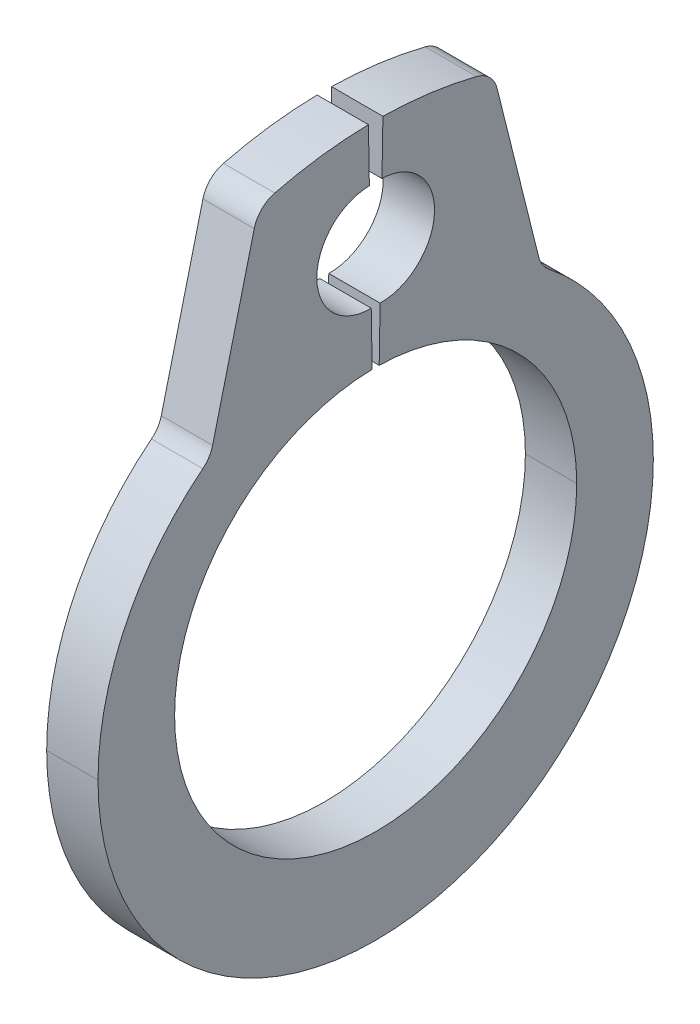
ISO-10303-21;
HEADER;
FILE_DESCRIPTION(('STEP AP214'),'2;1');
FILE_NAME('part.step','',(''),(''),'','','');
FILE_SCHEMA(('AUTOMOTIVE_DESIGN { 1 0 10303 214 1 1 1 1 }'));
ENDSEC;
DATA;
#1=APPLICATION_CONTEXT('core data for automotive mechanical design processes');
#2=APPLICATION_PROTOCOL_DEFINITION('international standard','automotive_design',2000,#1);
#3=PRODUCT_CONTEXT('',#1,'mechanical');
#4=PRODUCT('Part','Part','',(#3));
#5=PRODUCT_RELATED_PRODUCT_CATEGORY('part','',(#4));
#6=PRODUCT_DEFINITION_FORMATION('','',#4);
#7=PRODUCT_DEFINITION_CONTEXT('part definition',#1,'design');
#8=PRODUCT_DEFINITION('design','',#6,#7);
#9=PRODUCT_DEFINITION_SHAPE('','',#8);
#10=(LENGTH_UNIT() NAMED_UNIT(*) SI_UNIT(.MILLI.,.METRE.));
#11=(NAMED_UNIT(*) PLANE_ANGLE_UNIT() SI_UNIT($,.RADIAN.));
#12=(NAMED_UNIT(*) SI_UNIT($,.STERADIAN.) SOLID_ANGLE_UNIT());
#13=UNCERTAINTY_MEASURE_WITH_UNIT(LENGTH_MEASURE(1.E-05),#10,'distance_accuracy_value','');
#14=(GEOMETRIC_REPRESENTATION_CONTEXT(3) GLOBAL_UNCERTAINTY_ASSIGNED_CONTEXT((#13)) GLOBAL_UNIT_ASSIGNED_CONTEXT((#10,
#11,#12)) REPRESENTATION_CONTEXT('',''));
#15=CARTESIAN_POINT('',(0.,0.,0.));
#16=DIRECTION('',(0.,0.,1.));
#17=DIRECTION('',(1.,0.,0.));
#18=AXIS2_PLACEMENT_3D('',#15,#16,#17);
#19=CARTESIAN_POINT('',(0.3,2.59327635266096,-2.2258231062956));
#20=DIRECTION('',(-1.,0.,0.));
#21=DIRECTION('',(0.,0.,-1.));
#22=AXIS2_PLACEMENT_3D('',#19,#20,#21);
#23=CYLINDRICAL_SURFACE('',#22,0.33);
#24=CARTESIAN_POINT('',(0.3,2.59327635266096,-2.2258231062956));
#25=DIRECTION('',(-1.,0.,0.));
#26=DIRECTION('',(0.,0.,-1.));
#27=AXIS2_PLACEMENT_3D('',#24,#25,#26);
#28=CIRCLE('',#27,0.33);
#29=CARTESIAN_POINT('',(0.3,2.33502573755133,-2.02038060875555));
#30=VERTEX_POINT('',#29);
#31=CARTESIAN_POINT('',(0.3,2.51344212711308,-1.90562551662452));
#32=VERTEX_POINT('',#31);
#33=EDGE_CURVE('E150',#30,#32,#28,.T.);
#34=ORIENTED_EDGE('',*,*,#33,.F.);
#35=DIRECTION('',(1.,0.,0.));
#36=VECTOR('',#35,1.);
#37=CARTESIAN_POINT('',(0.3,2.33502573755133,-2.02038060875555));
#38=LINE('',#37,#36);
#39=CARTESIAN_POINT('',(-0.3,2.33502573755133,-2.02038060875555));
#40=VERTEX_POINT('',#39);
#41=EDGE_CURVE('E200',#40,#30,#38,.T.);
#42=ORIENTED_EDGE('',*,*,#41,.F.);
#43=CARTESIAN_POINT('',(-0.3,2.59327635266096,-2.2258231062956));
#44=DIRECTION('',(1.,0.,0.));
#45=DIRECTION('',(0.,0.,-1.));
#46=AXIS2_PLACEMENT_3D('',#43,#44,#45);
#47=CIRCLE('',#46,0.33);
#48=CARTESIAN_POINT('',(-0.3,2.51344212711308,-1.90562551662452));
#49=VERTEX_POINT('',#48);
#50=EDGE_CURVE('E28',#49,#40,#47,.T.);
#51=ORIENTED_EDGE('',*,*,#50,.F.);
#52=DIRECTION('',(-1.,0.,0.));
#53=VECTOR('',#52,1.);
#54=CARTESIAN_POINT('',(-0.3,2.51344212711308,-1.90562551662452));
#55=LINE('',#54,#53);
#56=EDGE_CURVE('E197',#32,#49,#55,.T.);
#57=ORIENTED_EDGE('',*,*,#56,.F.);
#58=EDGE_LOOP('',(#34,#42,#51,#57));
#59=FACE_BOUND('',#58,.T.);
#60=ADVANCED_FACE('F17',(#59),#23,.F.);
#61=CARTESIAN_POINT('',(0.3,4.38434476089471,-1.09905460174425));
#62=DIRECTION('',(-1.,0.,0.));
#63=DIRECTION('',(0.,0.,-1.));
#64=AXIS2_PLACEMENT_3D('',#61,#62,#63);
#65=CYLINDRICAL_SURFACE('',#64,0.33);
#66=CARTESIAN_POINT('',(0.3,4.38434476089471,-1.09905460174425));
#67=DIRECTION('',(1.,0.,0.));
#68=DIRECTION('',(0.,0.,-1.));
#69=AXIS2_PLACEMENT_3D('',#66,#67,#68);
#70=CIRCLE('',#69,0.33);
#71=CARTESIAN_POINT('',(0.3,4.4641789864426,-1.41925219141532));
#72=VERTEX_POINT('',#71);
#73=CARTESIAN_POINT('',(0.3,4.70444072795118,-1.17929531381849));
#74=VERTEX_POINT('',#73);
#75=EDGE_CURVE('E140',#72,#74,#70,.T.);
#76=ORIENTED_EDGE('',*,*,#75,.F.);
#77=DIRECTION('',(1.,0.,0.));
#78=VECTOR('',#77,1.);
#79=CARTESIAN_POINT('',(0.3,4.4641789864426,-1.41925219141532));
#80=LINE('',#79,#78);
#81=CARTESIAN_POINT('',(-0.3,4.4641789864426,-1.41925219141532));
#82=VERTEX_POINT('',#81);
#83=EDGE_CURVE('E222',#82,#72,#80,.T.);
#84=ORIENTED_EDGE('',*,*,#83,.F.);
#85=CARTESIAN_POINT('',(-0.3,4.38434476089471,-1.09905460174425));
#86=DIRECTION('',(-1.,0.,0.));
#87=DIRECTION('',(0.,0.,-1.));
#88=AXIS2_PLACEMENT_3D('',#85,#86,#87);
#89=CIRCLE('',#88,0.33);
#90=CARTESIAN_POINT('',(-0.3,4.70444072795118,-1.17929531381849));
#91=VERTEX_POINT('',#90);
#92=EDGE_CURVE('E206',#91,#82,#89,.T.);
#93=ORIENTED_EDGE('',*,*,#92,.F.);
#94=DIRECTION('',(-1.,0.,0.));
#95=VECTOR('',#94,1.);
#96=CARTESIAN_POINT('',(0.3,4.70444072795118,-1.17929531381849));
#97=LINE('',#96,#95);
#98=EDGE_CURVE('E257',#74,#91,#97,.T.);
#99=ORIENTED_EDGE('',*,*,#98,.F.);
#100=EDGE_LOOP('',(#76,#84,#93,#99));
#101=FACE_BOUND('',#100,.T.);
#102=ADVANCED_FACE('F461',(#101),#65,.T.);
#103=CARTESIAN_POINT('',(0.3,4.3843447608947,1.09905460174425));
#104=DIRECTION('',(-1.,0.,0.));
#105=DIRECTION('',(0.,0.,-1.));
#106=AXIS2_PLACEMENT_3D('',#103,#104,#105);
#107=CYLINDRICAL_SURFACE('',#106,0.33);
#108=CARTESIAN_POINT('',(0.3,4.3843447608947,1.09905460174425));
#109=DIRECTION('',(1.,0.,0.));
#110=DIRECTION('',(0.,0.,-1.));
#111=AXIS2_PLACEMENT_3D('',#108,#109,#110);
#112=CIRCLE('',#111,0.33);
#113=CARTESIAN_POINT('',(0.3,4.70444072795117,1.1792953138185));
#114=VERTEX_POINT('',#113);
#115=CARTESIAN_POINT('',(0.3,4.46417898644259,1.41925219141533));
#116=VERTEX_POINT('',#115);
#117=EDGE_CURVE('E408',#114,#116,#112,.T.);
#118=ORIENTED_EDGE('',*,*,#117,.F.);
#119=DIRECTION('',(1.,0.,0.));
#120=VECTOR('',#119,1.);
#121=CARTESIAN_POINT('',(0.3,4.70444072795117,1.1792953138185));
#122=LINE('',#121,#120);
#123=CARTESIAN_POINT('',(-0.3,4.70444072795117,1.1792953138185));
#124=VERTEX_POINT('',#123);
#125=EDGE_CURVE('E293',#124,#114,#122,.T.);
#126=ORIENTED_EDGE('',*,*,#125,.F.);
#127=CARTESIAN_POINT('',(-0.3,4.3843447608947,1.09905460174425));
#128=DIRECTION('',(-1.,0.,0.));
#129=DIRECTION('',(0.,0.,-1.));
#130=AXIS2_PLACEMENT_3D('',#127,#128,#129);
#131=CIRCLE('',#130,0.33);
#132=CARTESIAN_POINT('',(-0.3,4.46417898644259,1.41925219141533));
#133=VERTEX_POINT('',#132);
#134=EDGE_CURVE('E338',#133,#124,#131,.T.);
#135=ORIENTED_EDGE('',*,*,#134,.F.);
#136=DIRECTION('',(-1.,0.,0.));
#137=VECTOR('',#136,1.);
#138=CARTESIAN_POINT('',(0.3,4.46417898644259,1.41925219141533));
#139=LINE('',#138,#137);
#140=EDGE_CURVE('E245',#116,#133,#139,.T.);
#141=ORIENTED_EDGE('',*,*,#140,.F.);
#142=EDGE_LOOP('',(#118,#126,#135,#141));
#143=FACE_BOUND('',#142,.T.);
#144=ADVANCED_FACE('F459',(#143),#107,.T.);
#145=CARTESIAN_POINT('',(0.3,2.59327635266096,2.22582310629561));
#146=DIRECTION('',(-1.,0.,0.));
#147=DIRECTION('',(0.,0.,-1.));
#148=AXIS2_PLACEMENT_3D('',#145,#146,#147);
#149=CYLINDRICAL_SURFACE('',#148,0.33);
#150=CARTESIAN_POINT('',(0.3,2.59327635266096,2.22582310629561));
#151=DIRECTION('',(-1.,0.,0.));
#152=DIRECTION('',(0.,0.,-1.));
#153=AXIS2_PLACEMENT_3D('',#150,#151,#152);
#154=CIRCLE('',#153,0.33);
#155=CARTESIAN_POINT('',(0.3,2.51344212711307,1.90562551662453));
#156=VERTEX_POINT('',#155);
#157=CARTESIAN_POINT('',(0.3,2.33502573755132,2.02038060875555));
#158=VERTEX_POINT('',#157);
#159=EDGE_CURVE('E347',#156,#158,#154,.T.);
#160=ORIENTED_EDGE('',*,*,#159,.F.);
#161=DIRECTION('',(1.,0.,0.));
#162=VECTOR('',#161,1.);
#163=CARTESIAN_POINT('',(0.3,2.51344212711307,1.90562551662453));
#164=LINE('',#163,#162);
#165=CARTESIAN_POINT('',(-0.3,2.51344212711307,1.90562551662453));
#166=VERTEX_POINT('',#165);
#167=EDGE_CURVE('E345',#166,#156,#164,.T.);
#168=ORIENTED_EDGE('',*,*,#167,.F.);
#169=CARTESIAN_POINT('',(-0.3,2.59327635266096,2.22582310629561));
#170=DIRECTION('',(1.,0.,0.));
#171=DIRECTION('',(0.,0.,-1.));
#172=AXIS2_PLACEMENT_3D('',#169,#170,#171);
#173=CIRCLE('',#172,0.33);
#174=CARTESIAN_POINT('',(-0.3,2.33502573755132,2.02038060875555));
#175=VERTEX_POINT('',#174);
#176=EDGE_CURVE('E11',#175,#166,#173,.T.);
#177=ORIENTED_EDGE('',*,*,#176,.F.);
#178=DIRECTION('',(-1.,0.,0.));
#179=VECTOR('',#178,1.);
#180=CARTESIAN_POINT('',(0.3,2.33502573755132,2.02038060875555));
#181=LINE('',#180,#179);
#182=EDGE_CURVE('E231',#158,#175,#181,.T.);
#183=ORIENTED_EDGE('',*,*,#182,.F.);
#184=EDGE_LOOP('',(#160,#168,#177,#183));
#185=FACE_BOUND('',#184,.T.);
#186=ADVANCED_FACE('F346',(#185),#149,.F.);
#187=CARTESIAN_POINT('',(-0.3,0.,0.));
#188=DIRECTION('',(1.,0.,0.));
#189=DIRECTION('',(0.,1.,0.));
#190=AXIS2_PLACEMENT_3D('',#187,#188,#189);
#191=PLANE('',#190);
#192=DIRECTION('',(0.,-0.970295726275997,0.241921895599664));
#193=VECTOR('',#192,1.);
#194=CARTESIAN_POINT('',(-0.3,4.65175064164192,1.37248532523449));
#195=LINE('',#194,#193);
#196=EDGE_CURVE('E342',#133,#166,#195,.T.);
#197=ORIENTED_EDGE('',*,*,#196,.F.);
#198=ORIENTED_EDGE('',*,*,#134,.T.);
#199=CARTESIAN_POINT('',(-0.3,0.,0.));
#200=DIRECTION('',(1.,0.,0.));
#201=DIRECTION('',(0.,0.,-1.));
#202=AXIS2_PLACEMENT_3D('',#199,#200,#201);
#203=CIRCLE('',#202,4.85);
#204=CARTESIAN_POINT('',(-0.3,4.8492613215085,0.0846441712208252));
#205=VERTEX_POINT('',#204);
#206=EDGE_CURVE('E285',#205,#124,#203,.T.);
#207=ORIENTED_EDGE('',*,*,#206,.F.);
#208=DIRECTION('',(0.,0.999847695156391,0.0174524064372835));
#209=VECTOR('',#208,1.);
#210=CARTESIAN_POINT('',(-0.3,4.22435651203575,0.073736417197523));
#211=LINE('',#210,#209);
#212=CARTESIAN_POINT('',(-0.3,4.22435651203575,0.0737364171975229));
#213=VERTEX_POINT('',#212);
#214=EDGE_CURVE('E267',#213,#205,#211,.T.);
#215=ORIENTED_EDGE('',*,*,#214,.F.);
#216=CARTESIAN_POINT('',(-0.3,3.59945170256301,0.0628286631742208));
#217=DIRECTION('',(-1.,0.,0.));
#218=DIRECTION('',(0.,0.,1.));
#219=AXIS2_PLACEMENT_3D('',#216,#217,#218);
#220=CIRCLE('',#219,0.625);
#221=CARTESIAN_POINT('',(-0.3,3.59945170256301,0.68782866317422));
#222=VERTEX_POINT('',#221);
#223=EDGE_CURVE('E310',#222,#213,#220,.T.);
#224=ORIENTED_EDGE('',*,*,#223,.F.);
#225=CARTESIAN_POINT('',(-0.3,3.59945170256301,0.0628286631742208));
#226=DIRECTION('',(-1.,0.,0.));
#227=DIRECTION('',(0.,0.,1.));
#228=AXIS2_PLACEMENT_3D('',#225,#226,#227);
#229=CIRCLE('',#228,0.625);
#230=CARTESIAN_POINT('',(-0.3,2.97454689309026,0.0519209091509186));
#231=VERTEX_POINT('',#230);
#232=EDGE_CURVE('E271',#231,#222,#229,.T.);
#233=ORIENTED_EDGE('',*,*,#232,.F.);
#234=DIRECTION('',(0.,0.999847695156391,0.0174524064372835));
#235=VECTOR('',#234,1.);
#236=CARTESIAN_POINT('',(-0.3,2.97454689309026,0.0519209091509186));
#237=LINE('',#236,#235);
#238=CARTESIAN_POINT('',(-0.3,2.34964208361752,0.0410131551276164));
#239=VERTEX_POINT('',#238);
#240=EDGE_CURVE('E394',#239,#231,#237,.T.);
#241=ORIENTED_EDGE('',*,*,#240,.F.);
#242=CARTESIAN_POINT('',(-0.3,0.,0.));
#243=DIRECTION('',(-1.,0.,0.));
#244=DIRECTION('',(0.,0.,-1.));
#245=AXIS2_PLACEMENT_3D('',#242,#243,#244);
#246=CIRCLE('',#245,2.35);
#247=CARTESIAN_POINT('',(-0.3,0.,2.35));
#248=VERTEX_POINT('',#247);
#249=EDGE_CURVE('E239',#248,#239,#246,.T.);
#250=ORIENTED_EDGE('',*,*,#249,.F.);
#251=CARTESIAN_POINT('',(-0.3,0.,0.));
#252=DIRECTION('',(-1.,0.,0.));
#253=DIRECTION('',(0.,0.,-1.));
#254=AXIS2_PLACEMENT_3D('',#251,#252,#253);
#255=CIRCLE('',#254,2.35);
#256=CARTESIAN_POINT('',(-0.3,0.,-2.35));
#257=VERTEX_POINT('',#256);
#258=EDGE_CURVE('E362',#257,#248,#255,.T.);
#259=ORIENTED_EDGE('',*,*,#258,.F.);
#260=CARTESIAN_POINT('',(-0.3,0.,0.));
#261=DIRECTION('',(-1.,0.,0.));
#262=DIRECTION('',(0.,0.,-1.));
#263=AXIS2_PLACEMENT_3D('',#260,#261,#262);
#264=CIRCLE('',#263,2.35);
#265=CARTESIAN_POINT('',(-0.3,2.34964208361752,-0.0410131551276164));
#266=VERTEX_POINT('',#265);
#267=EDGE_CURVE('E391',#266,#257,#264,.T.);
#268=ORIENTED_EDGE('',*,*,#267,.F.);
#269=DIRECTION('',(0.,-0.999847695156391,0.0174524064372832));
#270=VECTOR('',#269,1.);
#271=CARTESIAN_POINT('',(-0.3,2.34964208361752,-0.0410131551276164));
#272=LINE('',#271,#270);
#273=CARTESIAN_POINT('',(-0.3,2.97454689309027,-0.0519209091509186));
#274=VERTEX_POINT('',#273);
#275=EDGE_CURVE('E409',#274,#266,#272,.T.);
#276=ORIENTED_EDGE('',*,*,#275,.F.);
#277=CARTESIAN_POINT('',(-0.3,3.59945170256301,-0.0628286631742206));
#278=DIRECTION('',(-1.,0.,0.));
#279=DIRECTION('',(0.,0.,1.));
#280=AXIS2_PLACEMENT_3D('',#277,#278,#279);
#281=CIRCLE('',#280,0.625);
#282=CARTESIAN_POINT('',(-0.3,4.22435651203576,-0.0737364171975228));
#283=VERTEX_POINT('',#282);
#284=EDGE_CURVE('E372',#283,#274,#281,.T.);
#285=ORIENTED_EDGE('',*,*,#284,.F.);
#286=DIRECTION('',(0.,-0.999847695156391,0.0174524064372835));
#287=VECTOR('',#286,1.);
#288=CARTESIAN_POINT('',(-0.3,4.22435651203576,-0.0737364171975228));
#289=LINE('',#288,#287);
#290=CARTESIAN_POINT('',(-0.3,4.84926132150851,-0.084644171220825));
#291=VERTEX_POINT('',#290);
#292=EDGE_CURVE('E371',#291,#283,#289,.T.);
#293=ORIENTED_EDGE('',*,*,#292,.F.);
#294=CARTESIAN_POINT('',(-0.3,0.,0.));
#295=DIRECTION('',(1.,0.,0.));
#296=DIRECTION('',(0.,0.,1.));
#297=AXIS2_PLACEMENT_3D('',#294,#295,#296);
#298=CIRCLE('',#297,4.85);
#299=EDGE_CURVE('E261',#91,#291,#298,.T.);
#300=ORIENTED_EDGE('',*,*,#299,.F.);
#301=ORIENTED_EDGE('',*,*,#92,.T.);
#302=DIRECTION('',(0.,0.970295726275998,0.241921895599662));
#303=VECTOR('',#302,1.);
#304=CARTESIAN_POINT('',(-0.3,4.65175064164193,-1.37248532523449));
#305=LINE('',#304,#303);
#306=EDGE_CURVE('E212',#49,#82,#305,.T.);
#307=ORIENTED_EDGE('',*,*,#306,.F.);
#308=ORIENTED_EDGE('',*,*,#50,.T.);
#309=CARTESIAN_POINT('',(-0.3,-0.204685087688119,0.));
#310=DIRECTION('',(1.,0.,0.));
#311=DIRECTION('',(0.,0.,-1.));
#312=AXIS2_PLACEMENT_3D('',#309,#310,#311);
#313=CIRCLE('',#312,3.24531491231188);
#314=CARTESIAN_POINT('',(-0.3,-0.204685087688119,-3.24531491231188));
#315=VERTEX_POINT('',#314);
#316=EDGE_CURVE('E254',#315,#40,#313,.T.);
#317=ORIENTED_EDGE('',*,*,#316,.F.);
#318=CARTESIAN_POINT('',(-0.3,-0.204685087688119,0.));
#319=DIRECTION('',(1.,0.,0.));
#320=DIRECTION('',(0.,0.,-1.));
#321=AXIS2_PLACEMENT_3D('',#318,#319,#320);
#322=CIRCLE('',#321,3.24531491231188);
#323=CARTESIAN_POINT('',(-0.3,-0.204685087688119,3.24531491231188));
#324=VERTEX_POINT('',#323);
#325=EDGE_CURVE('E281',#324,#315,#322,.T.);
#326=ORIENTED_EDGE('',*,*,#325,.F.);
#327=CARTESIAN_POINT('',(-0.3,-0.204685087688119,0.));
#328=DIRECTION('',(1.,0.,0.));
#329=DIRECTION('',(0.,0.,-1.));
#330=AXIS2_PLACEMENT_3D('',#327,#328,#329);
#331=CIRCLE('',#330,3.24531491231188);
#332=EDGE_CURVE('E223',#175,#324,#331,.T.);
#333=ORIENTED_EDGE('',*,*,#332,.F.);
#334=ORIENTED_EDGE('',*,*,#176,.T.);
#335=EDGE_LOOP('',(#197,#198,#207,#215,#224,#233,#241,#250,#259,#268,#276,#285,#293,#300,#301,
#307,#308,#317,#326,#333,#334));
#336=FACE_BOUND('',#335,.T.);
#337=ADVANCED_FACE('F218',(#336),#191,.F.);
#338=CARTESIAN_POINT('',(0.3,0.,0.));
#339=DIRECTION('',(1.,0.,0.));
#340=DIRECTION('',(0.,1.,0.));
#341=AXIS2_PLACEMENT_3D('',#338,#339,#340);
#342=PLANE('',#341);
#343=CARTESIAN_POINT('',(0.3,0.,0.));
#344=DIRECTION('',(1.,0.,0.));
#345=DIRECTION('',(0.,0.,-1.));
#346=AXIS2_PLACEMENT_3D('',#343,#344,#345);
#347=CIRCLE('',#346,4.85);
#348=CARTESIAN_POINT('',(0.3,4.8492613215085,0.0846441712208252));
#349=VERTEX_POINT('',#348);
#350=EDGE_CURVE('E21',#349,#114,#347,.T.);
#351=ORIENTED_EDGE('',*,*,#350,.T.);
#352=ORIENTED_EDGE('',*,*,#117,.T.);
#353=DIRECTION('',(0.,-0.970295726275997,0.241921895599664));
#354=VECTOR('',#353,1.);
#355=CARTESIAN_POINT('',(0.3,4.65175064164192,1.37248532523449));
#356=LINE('',#355,#354);
#357=EDGE_CURVE('E253',#116,#156,#356,.T.);
#358=ORIENTED_EDGE('',*,*,#357,.T.);
#359=ORIENTED_EDGE('',*,*,#159,.T.);
#360=CARTESIAN_POINT('',(0.3,-0.204685087688119,0.));
#361=DIRECTION('',(1.,0.,0.));
#362=DIRECTION('',(0.,0.,-1.));
#363=AXIS2_PLACEMENT_3D('',#360,#361,#362);
#364=CIRCLE('',#363,3.24531491231188);
#365=CARTESIAN_POINT('',(0.3,-0.204685087688119,3.24531491231188));
#366=VERTEX_POINT('',#365);
#367=EDGE_CURVE('E242',#158,#366,#364,.T.);
#368=ORIENTED_EDGE('',*,*,#367,.T.);
#369=CARTESIAN_POINT('',(0.3,-0.204685087688119,0.));
#370=DIRECTION('',(1.,0.,0.));
#371=DIRECTION('',(0.,0.,-1.));
#372=AXIS2_PLACEMENT_3D('',#369,#370,#371);
#373=CIRCLE('',#372,3.24531491231188);
#374=CARTESIAN_POINT('',(0.3,-0.204685087688119,-3.24531491231188));
#375=VERTEX_POINT('',#374);
#376=EDGE_CURVE('E382',#366,#375,#373,.T.);
#377=ORIENTED_EDGE('',*,*,#376,.T.);
#378=CARTESIAN_POINT('',(0.3,-0.204685087688119,0.));
#379=DIRECTION('',(1.,0.,0.));
#380=DIRECTION('',(0.,0.,-1.));
#381=AXIS2_PLACEMENT_3D('',#378,#379,#380);
#382=CIRCLE('',#381,3.24531491231188);
#383=EDGE_CURVE('E246',#375,#30,#382,.T.);
#384=ORIENTED_EDGE('',*,*,#383,.T.);
#385=ORIENTED_EDGE('',*,*,#33,.T.);
#386=DIRECTION('',(0.,0.970295726275998,0.241921895599662));
#387=VECTOR('',#386,1.);
#388=CARTESIAN_POINT('',(0.3,4.65175064164193,-1.37248532523449));
#389=LINE('',#388,#387);
#390=EDGE_CURVE('E213',#32,#72,#389,.T.);
#391=ORIENTED_EDGE('',*,*,#390,.T.);
#392=ORIENTED_EDGE('',*,*,#75,.T.);
#393=CARTESIAN_POINT('',(0.3,0.,0.));
#394=DIRECTION('',(1.,0.,0.));
#395=DIRECTION('',(0.,0.,1.));
#396=AXIS2_PLACEMENT_3D('',#393,#394,#395);
#397=CIRCLE('',#396,4.85);
#398=CARTESIAN_POINT('',(0.3,4.84926132150851,-0.084644171220825));
#399=VERTEX_POINT('',#398);
#400=EDGE_CURVE('E215',#74,#399,#397,.T.);
#401=ORIENTED_EDGE('',*,*,#400,.T.);
#402=DIRECTION('',(0.,-0.999847695156391,0.0174524064372835));
#403=VECTOR('',#402,1.);
#404=CARTESIAN_POINT('',(0.3,4.22435651203576,-0.0737364171975228));
#405=LINE('',#404,#403);
#406=CARTESIAN_POINT('',(0.3,4.22435651203576,-0.0737364171975228));
#407=VERTEX_POINT('',#406);
#408=EDGE_CURVE('E377',#399,#407,#405,.T.);
#409=ORIENTED_EDGE('',*,*,#408,.T.);
#410=CARTESIAN_POINT('',(0.3,3.59945170256301,-0.0628286631742206));
#411=DIRECTION('',(-1.,0.,0.));
#412=DIRECTION('',(0.,0.,1.));
#413=AXIS2_PLACEMENT_3D('',#410,#411,#412);
#414=CIRCLE('',#413,0.625);
#415=CARTESIAN_POINT('',(0.3,2.97454689309027,-0.0519209091509186));
#416=VERTEX_POINT('',#415);
#417=EDGE_CURVE('E443',#407,#416,#414,.T.);
#418=ORIENTED_EDGE('',*,*,#417,.T.);
#419=DIRECTION('',(0.,-0.999847695156391,0.0174524064372832));
#420=VECTOR('',#419,1.);
#421=CARTESIAN_POINT('',(0.3,2.34964208361752,-0.0410131551276164));
#422=LINE('',#421,#420);
#423=CARTESIAN_POINT('',(0.3,2.34964208361752,-0.0410131551276164));
#424=VERTEX_POINT('',#423);
#425=EDGE_CURVE('E42',#416,#424,#422,.T.);
#426=ORIENTED_EDGE('',*,*,#425,.T.);
#427=CARTESIAN_POINT('',(0.3,0.,0.));
#428=DIRECTION('',(-1.,0.,0.));
#429=DIRECTION('',(0.,0.,-1.));
#430=AXIS2_PLACEMENT_3D('',#427,#428,#429);
#431=CIRCLE('',#430,2.35);
#432=CARTESIAN_POINT('',(0.3,0.,-2.35));
#433=VERTEX_POINT('',#432);
#434=EDGE_CURVE('E262',#424,#433,#431,.T.);
#435=ORIENTED_EDGE('',*,*,#434,.T.);
#436=CARTESIAN_POINT('',(0.3,0.,0.));
#437=DIRECTION('',(-1.,0.,0.));
#438=DIRECTION('',(0.,0.,-1.));
#439=AXIS2_PLACEMENT_3D('',#436,#437,#438);
#440=CIRCLE('',#439,2.35);
#441=CARTESIAN_POINT('',(0.3,0.,2.35));
#442=VERTEX_POINT('',#441);
#443=EDGE_CURVE('E426',#433,#442,#440,.T.);
#444=ORIENTED_EDGE('',*,*,#443,.T.);
#445=CARTESIAN_POINT('',(0.3,0.,0.));
#446=DIRECTION('',(-1.,0.,0.));
#447=DIRECTION('',(0.,0.,-1.));
#448=AXIS2_PLACEMENT_3D('',#445,#446,#447);
#449=CIRCLE('',#448,2.35);
#450=CARTESIAN_POINT('',(0.3,2.34964208361752,0.0410131551276164));
#451=VERTEX_POINT('',#450);
#452=EDGE_CURVE('E236',#442,#451,#449,.T.);
#453=ORIENTED_EDGE('',*,*,#452,.T.);
#454=DIRECTION('',(0.,0.999847695156391,0.0174524064372835));
#455=VECTOR('',#454,1.);
#456=CARTESIAN_POINT('',(0.3,2.97454689309026,0.0519209091509186));
#457=LINE('',#456,#455);
#458=CARTESIAN_POINT('',(0.3,2.97454689309026,0.0519209091509186));
#459=VERTEX_POINT('',#458);
#460=EDGE_CURVE('E400',#451,#459,#457,.T.);
#461=ORIENTED_EDGE('',*,*,#460,.T.);
#462=CARTESIAN_POINT('',(0.3,3.59945170256301,0.0628286631742208));
#463=DIRECTION('',(-1.,0.,0.));
#464=DIRECTION('',(0.,0.,1.));
#465=AXIS2_PLACEMENT_3D('',#462,#463,#464);
#466=CIRCLE('',#465,0.625);
#467=CARTESIAN_POINT('',(0.3,3.59945170256301,0.68782866317422));
#468=VERTEX_POINT('',#467);
#469=EDGE_CURVE('E404',#459,#468,#466,.T.);
#470=ORIENTED_EDGE('',*,*,#469,.T.);
#471=CARTESIAN_POINT('',(0.3,3.59945170256301,0.0628286631742208));
#472=DIRECTION('',(-1.,0.,0.));
#473=DIRECTION('',(0.,0.,1.));
#474=AXIS2_PLACEMENT_3D('',#471,#472,#473);
#475=CIRCLE('',#474,0.625);
#476=CARTESIAN_POINT('',(0.3,4.22435651203575,0.0737364171975229));
#477=VERTEX_POINT('',#476);
#478=EDGE_CURVE('E277',#468,#477,#475,.T.);
#479=ORIENTED_EDGE('',*,*,#478,.T.);
#480=DIRECTION('',(0.,0.999847695156391,0.0174524064372835));
#481=VECTOR('',#480,1.);
#482=CARTESIAN_POINT('',(0.3,4.22435651203575,0.073736417197523));
#483=LINE('',#482,#481);
#484=EDGE_CURVE('E282',#477,#349,#483,.T.);
#485=ORIENTED_EDGE('',*,*,#484,.T.);
#486=EDGE_LOOP('',(#351,#352,#358,#359,#368,#377,#384,#385,#391,#392,#401,#409,#418,#426,#435,
#444,#453,#461,#470,#479,#485));
#487=FACE_BOUND('',#486,.T.);
#488=ADVANCED_FACE('F456',(#487),#342,.T.);
#489=CARTESIAN_POINT('',(0.3,2.34964208361752,-0.0410131551276164));
#490=DIRECTION('',(0.,-0.0174524064372832,-0.999847695156391));
#491=DIRECTION('',(0.,-0.999847695156391,0.0174524064372832));
#492=AXIS2_PLACEMENT_3D('',#489,#490,#491);
#493=PLANE('',#492);
#494=ORIENTED_EDGE('',*,*,#275,.T.);
#495=DIRECTION('',(-1.,0.,0.));
#496=VECTOR('',#495,1.);
#497=CARTESIAN_POINT('',(0.3,2.34964208361752,-0.0410131551276164));
#498=LINE('',#497,#496);
#499=EDGE_CURVE('E265',#424,#266,#498,.T.);
#500=ORIENTED_EDGE('',*,*,#499,.F.);
#501=ORIENTED_EDGE('',*,*,#425,.F.);
#502=DIRECTION('',(-1.,0.,0.));
#503=VECTOR('',#502,1.);
#504=CARTESIAN_POINT('',(0.3,2.97454689309027,-0.0519209091509186));
#505=LINE('',#504,#503);
#506=EDGE_CURVE('E376',#416,#274,#505,.T.);
#507=ORIENTED_EDGE('',*,*,#506,.T.);
#508=EDGE_LOOP('',(#494,#500,#501,#507));
#509=FACE_BOUND('',#508,.T.);
#510=ADVANCED_FACE('F498',(#509),#493,.F.);
#511=CARTESIAN_POINT('',(0.3,3.59945170256301,-0.0628286631742206));
#512=DIRECTION('',(-1.,0.,0.));
#513=DIRECTION('',(0.,0.,-1.));
#514=AXIS2_PLACEMENT_3D('',#511,#512,#513);
#515=CYLINDRICAL_SURFACE('',#514,0.625);
#516=ORIENTED_EDGE('',*,*,#284,.T.);
#517=ORIENTED_EDGE('',*,*,#506,.F.);
#518=ORIENTED_EDGE('',*,*,#417,.F.);
#519=DIRECTION('',(-1.,0.,0.));
#520=VECTOR('',#519,1.);
#521=CARTESIAN_POINT('',(0.3,4.22435651203576,-0.0737364171975228));
#522=LINE('',#521,#520);
#523=EDGE_CURVE('E421',#407,#283,#522,.T.);
#524=ORIENTED_EDGE('',*,*,#523,.T.);
#525=EDGE_LOOP('',(#516,#517,#518,#524));
#526=FACE_BOUND('',#525,.T.);
#527=ADVANCED_FACE('F501',(#526),#515,.F.);
#528=CARTESIAN_POINT('',(0.3,4.22435651203576,-0.0737364171975228));
#529=DIRECTION('',(0.,-0.0174524064372835,-0.999847695156391));
#530=DIRECTION('',(0.,-0.999847695156391,0.0174524064372835));
#531=AXIS2_PLACEMENT_3D('',#528,#529,#530);
#532=PLANE('',#531);
#533=ORIENTED_EDGE('',*,*,#292,.T.);
#534=ORIENTED_EDGE('',*,*,#523,.F.);
#535=ORIENTED_EDGE('',*,*,#408,.F.);
#536=DIRECTION('',(-1.,0.,0.));
#537=VECTOR('',#536,1.);
#538=CARTESIAN_POINT('',(0.3,4.84926132150851,-0.084644171220825));
#539=LINE('',#538,#537);
#540=EDGE_CURVE('E367',#399,#291,#539,.T.);
#541=ORIENTED_EDGE('',*,*,#540,.T.);
#542=EDGE_LOOP('',(#533,#534,#535,#541));
#543=FACE_BOUND('',#542,.T.);
#544=ADVANCED_FACE('F504',(#543),#532,.F.);
#545=CARTESIAN_POINT('',(0.3,0.,0.));
#546=DIRECTION('',(-1.,0.,0.));
#547=DIRECTION('',(0.,0.,-1.));
#548=AXIS2_PLACEMENT_3D('',#545,#546,#547);
#549=CYLINDRICAL_SURFACE('',#548,4.85);
#550=ORIENTED_EDGE('',*,*,#400,.F.);
#551=ORIENTED_EDGE('',*,*,#98,.T.);
#552=ORIENTED_EDGE('',*,*,#299,.T.);
#553=ORIENTED_EDGE('',*,*,#540,.F.);
#554=EDGE_LOOP('',(#550,#551,#552,#553));
#555=FACE_BOUND('',#554,.T.);
#556=ADVANCED_FACE('F481',(#555),#549,.T.);
#557=CARTESIAN_POINT('',(0.3,4.65175064164193,-1.37248532523449));
#558=DIRECTION('',(0.,-0.241921895599662,0.970295726275998));
#559=DIRECTION('',(-1.,0.,0.));
#560=AXIS2_PLACEMENT_3D('',#557,#558,#559);
#561=PLANE('',#560);
#562=ORIENTED_EDGE('',*,*,#306,.T.);
#563=ORIENTED_EDGE('',*,*,#83,.T.);
#564=ORIENTED_EDGE('',*,*,#390,.F.);
#565=ORIENTED_EDGE('',*,*,#56,.T.);
#566=EDGE_LOOP('',(#562,#563,#564,#565));
#567=FACE_BOUND('',#566,.T.);
#568=ADVANCED_FACE('F210',(#567),#561,.F.);
#569=CARTESIAN_POINT('',(0.3,-0.204685087688119,0.));
#570=DIRECTION('',(-1.,0.,0.));
#571=DIRECTION('',(0.,0.,-1.));
#572=AXIS2_PLACEMENT_3D('',#569,#570,#571);
#573=CYLINDRICAL_SURFACE('',#572,3.24531491231188);
#574=DIRECTION('',(-1.,0.,0.));
#575=VECTOR('',#574,1.);
#576=CARTESIAN_POINT('',(0.3,-0.204685087688119,3.24531491231188));
#577=LINE('',#576,#575);
#578=EDGE_CURVE('E378',#366,#324,#577,.T.);
#579=ORIENTED_EDGE('',*,*,#578,.F.);
#580=ORIENTED_EDGE('',*,*,#367,.F.);
#581=ORIENTED_EDGE('',*,*,#182,.T.);
#582=ORIENTED_EDGE('',*,*,#332,.T.);
#583=EDGE_LOOP('',(#579,#580,#581,#582));
#584=FACE_BOUND('',#583,.T.);
#585=ADVANCED_FACE('F483',(#584),#573,.T.);
#586=CARTESIAN_POINT('',(0.3,4.65175064164192,1.37248532523449));
#587=DIRECTION('',(0.,-0.241921895599664,-0.970295726275997));
#588=DIRECTION('',(0.,-0.970295726275997,0.241921895599664));
#589=AXIS2_PLACEMENT_3D('',#586,#587,#588);
#590=PLANE('',#589);
#591=ORIENTED_EDGE('',*,*,#196,.T.);
#592=ORIENTED_EDGE('',*,*,#167,.T.);
#593=ORIENTED_EDGE('',*,*,#357,.F.);
#594=ORIENTED_EDGE('',*,*,#140,.T.);
#595=EDGE_LOOP('',(#591,#592,#593,#594));
#596=FACE_BOUND('',#595,.T.);
#597=ADVANCED_FACE('F353',(#596),#590,.F.);
#598=CARTESIAN_POINT('',(0.3,0.,0.));
#599=DIRECTION('',(-1.,0.,0.));
#600=DIRECTION('',(0.,0.,-1.));
#601=AXIS2_PLACEMENT_3D('',#598,#599,#600);
#602=CYLINDRICAL_SURFACE('',#601,4.85);
#603=ORIENTED_EDGE('',*,*,#206,.T.);
#604=ORIENTED_EDGE('',*,*,#125,.T.);
#605=ORIENTED_EDGE('',*,*,#350,.F.);
#606=DIRECTION('',(-1.,0.,0.));
#607=VECTOR('',#606,1.);
#608=CARTESIAN_POINT('',(0.3,4.8492613215085,0.0846441712208252));
#609=LINE('',#608,#607);
#610=EDGE_CURVE('E235',#349,#205,#609,.T.);
#611=ORIENTED_EDGE('',*,*,#610,.T.);
#612=EDGE_LOOP('',(#603,#604,#605,#611));
#613=FACE_BOUND('',#612,.T.);
#614=ADVANCED_FACE('F300',(#613),#602,.T.);
#615=CARTESIAN_POINT('',(0.3,4.22435651203575,0.073736417197523));
#616=DIRECTION('',(0.,-0.0174524064372835,0.999847695156391));
#617=DIRECTION('',(-1.,0.,0.));
#618=AXIS2_PLACEMENT_3D('',#615,#616,#617);
#619=PLANE('',#618);
#620=ORIENTED_EDGE('',*,*,#214,.T.);
#621=ORIENTED_EDGE('',*,*,#610,.F.);
#622=ORIENTED_EDGE('',*,*,#484,.F.);
#623=DIRECTION('',(-1.,0.,0.));
#624=VECTOR('',#623,1.);
#625=CARTESIAN_POINT('',(0.3,4.22435651203575,0.0737364171975229));
#626=LINE('',#625,#624);
#627=EDGE_CURVE('E307',#477,#213,#626,.T.);
#628=ORIENTED_EDGE('',*,*,#627,.T.);
#629=EDGE_LOOP('',(#620,#621,#622,#628));
#630=FACE_BOUND('',#629,.T.);
#631=ADVANCED_FACE('F305',(#630),#619,.F.);
#632=CARTESIAN_POINT('',(0.3,3.59945170256301,0.0628286631742208));
#633=DIRECTION('',(-1.,0.,0.));
#634=DIRECTION('',(0.,0.,-1.));
#635=AXIS2_PLACEMENT_3D('',#632,#633,#634);
#636=CYLINDRICAL_SURFACE('',#635,0.625);
#637=DIRECTION('',(-1.,0.,0.));
#638=VECTOR('',#637,1.);
#639=CARTESIAN_POINT('',(0.3,3.59945170256301,0.68782866317422));
#640=LINE('',#639,#638);
#641=EDGE_CURVE('E280',#468,#222,#640,.T.);
#642=ORIENTED_EDGE('',*,*,#641,.F.);
#643=ORIENTED_EDGE('',*,*,#469,.F.);
#644=DIRECTION('',(-1.,0.,0.));
#645=VECTOR('',#644,1.);
#646=CARTESIAN_POINT('',(0.3,2.97454689309026,0.0519209091509186));
#647=LINE('',#646,#645);
#648=EDGE_CURVE('E405',#459,#231,#647,.T.);
#649=ORIENTED_EDGE('',*,*,#648,.T.);
#650=ORIENTED_EDGE('',*,*,#232,.T.);
#651=EDGE_LOOP('',(#642,#643,#649,#650));
#652=FACE_BOUND('',#651,.T.);
#653=ADVANCED_FACE('F491',(#652),#636,.F.);
#654=CARTESIAN_POINT('',(0.3,2.97454689309026,0.0519209091509186));
#655=DIRECTION('',(0.,-0.0174524064372835,0.999847695156391));
#656=DIRECTION('',(-1.,0.,0.));
#657=AXIS2_PLACEMENT_3D('',#654,#655,#656);
#658=PLANE('',#657);
#659=ORIENTED_EDGE('',*,*,#240,.T.);
#660=ORIENTED_EDGE('',*,*,#648,.F.);
#661=ORIENTED_EDGE('',*,*,#460,.F.);
#662=DIRECTION('',(-1.,0.,0.));
#663=VECTOR('',#662,1.);
#664=CARTESIAN_POINT('',(0.3,2.34964208361752,0.0410131551276164));
#665=LINE('',#664,#663);
#666=EDGE_CURVE('E266',#451,#239,#665,.T.);
#667=ORIENTED_EDGE('',*,*,#666,.T.);
#668=EDGE_LOOP('',(#659,#660,#661,#667));
#669=FACE_BOUND('',#668,.T.);
#670=ADVANCED_FACE('F494',(#669),#658,.F.);
#671=CARTESIAN_POINT('',(0.3,0.,0.));
#672=DIRECTION('',(-1.,0.,0.));
#673=DIRECTION('',(0.,0.,-1.));
#674=AXIS2_PLACEMENT_3D('',#671,#672,#673);
#675=CYLINDRICAL_SURFACE('',#674,2.35);
#676=DIRECTION('',(-1.,0.,0.));
#677=VECTOR('',#676,1.);
#678=CARTESIAN_POINT('',(0.3,0.,-2.35));
#679=LINE('',#678,#677);
#680=EDGE_CURVE('E366',#433,#257,#679,.T.);
#681=ORIENTED_EDGE('',*,*,#680,.F.);
#682=ORIENTED_EDGE('',*,*,#434,.F.);
#683=ORIENTED_EDGE('',*,*,#499,.T.);
#684=ORIENTED_EDGE('',*,*,#267,.T.);
#685=EDGE_LOOP('',(#681,#682,#683,#684));
#686=FACE_BOUND('',#685,.T.);
#687=ADVANCED_FACE('F520',(#686),#675,.F.);
#688=CARTESIAN_POINT('',(0.3,0.,0.));
#689=DIRECTION('',(-1.,0.,0.));
#690=DIRECTION('',(0.,0.,-1.));
#691=AXIS2_PLACEMENT_3D('',#688,#689,#690);
#692=CYLINDRICAL_SURFACE('',#691,2.35);
#693=ORIENTED_EDGE('',*,*,#452,.F.);
#694=DIRECTION('',(-1.,0.,0.));
#695=VECTOR('',#694,1.);
#696=CARTESIAN_POINT('',(0.3,0.,2.35));
#697=LINE('',#696,#695);
#698=EDGE_CURVE('E240',#442,#248,#697,.T.);
#699=ORIENTED_EDGE('',*,*,#698,.T.);
#700=ORIENTED_EDGE('',*,*,#249,.T.);
#701=ORIENTED_EDGE('',*,*,#666,.F.);
#702=EDGE_LOOP('',(#693,#699,#700,#701));
#703=FACE_BOUND('',#702,.T.);
#704=ADVANCED_FACE('F19',(#703),#692,.F.);
#705=CARTESIAN_POINT('',(0.3,0.,0.));
#706=DIRECTION('',(-1.,0.,0.));
#707=DIRECTION('',(0.,0.,-1.));
#708=AXIS2_PLACEMENT_3D('',#705,#706,#707);
#709=CYLINDRICAL_SURFACE('',#708,2.35);
#710=ORIENTED_EDGE('',*,*,#443,.F.);
#711=ORIENTED_EDGE('',*,*,#680,.T.);
#712=ORIENTED_EDGE('',*,*,#258,.T.);
#713=ORIENTED_EDGE('',*,*,#698,.F.);
#714=EDGE_LOOP('',(#710,#711,#712,#713));
#715=FACE_BOUND('',#714,.T.);
#716=ADVANCED_FACE('F489',(#715),#709,.F.);
#717=CARTESIAN_POINT('',(0.3,3.59945170256301,0.0628286631742208));
#718=DIRECTION('',(-1.,0.,0.));
#719=DIRECTION('',(0.,0.,-1.));
#720=AXIS2_PLACEMENT_3D('',#717,#718,#719);
#721=CYLINDRICAL_SURFACE('',#720,0.625);
#722=ORIENTED_EDGE('',*,*,#478,.F.);
#723=ORIENTED_EDGE('',*,*,#641,.T.);
#724=ORIENTED_EDGE('',*,*,#223,.T.);
#725=ORIENTED_EDGE('',*,*,#627,.F.);
#726=EDGE_LOOP('',(#722,#723,#724,#725));
#727=FACE_BOUND('',#726,.T.);
#728=ADVANCED_FACE('F485',(#727),#721,.F.);
#729=CARTESIAN_POINT('',(0.3,-0.204685087688119,0.));
#730=DIRECTION('',(-1.,0.,0.));
#731=DIRECTION('',(0.,0.,-1.));
#732=AXIS2_PLACEMENT_3D('',#729,#730,#731);
#733=CYLINDRICAL_SURFACE('',#732,3.24531491231188);
#734=DIRECTION('',(-1.,0.,0.));
#735=VECTOR('',#734,1.);
#736=CARTESIAN_POINT('',(0.3,-0.204685087688119,-3.24531491231188));
#737=LINE('',#736,#735);
#738=EDGE_CURVE('E249',#375,#315,#737,.T.);
#739=ORIENTED_EDGE('',*,*,#738,.F.);
#740=ORIENTED_EDGE('',*,*,#376,.F.);
#741=ORIENTED_EDGE('',*,*,#578,.T.);
#742=ORIENTED_EDGE('',*,*,#325,.T.);
#743=EDGE_LOOP('',(#739,#740,#741,#742));
#744=FACE_BOUND('',#743,.T.);
#745=ADVANCED_FACE('F488',(#744),#733,.T.);
#746=CARTESIAN_POINT('',(0.3,-0.204685087688119,0.));
#747=DIRECTION('',(-1.,0.,0.));
#748=DIRECTION('',(0.,0.,-1.));
#749=AXIS2_PLACEMENT_3D('',#746,#747,#748);
#750=CYLINDRICAL_SURFACE('',#749,3.24531491231188);
#751=ORIENTED_EDGE('',*,*,#383,.F.);
#752=ORIENTED_EDGE('',*,*,#738,.T.);
#753=ORIENTED_EDGE('',*,*,#316,.T.);
#754=ORIENTED_EDGE('',*,*,#41,.T.);
#755=EDGE_LOOP('',(#751,#752,#753,#754));
#756=FACE_BOUND('',#755,.T.);
#757=ADVANCED_FACE('F508',(#756),#750,.T.);
#758=CLOSED_SHELL('',(#60,#102,#144,#186,#337,#488,#510,#527,#544,#556,#568,#585,#597,#614,#631,
#653,#670,#687,#704,#716,#728,#745,#757));
#759=MANIFOLD_SOLID_BREP('B1',#758);
#760=ADVANCED_BREP_SHAPE_REPRESENTATION('',(#18,#759),#14);
#761=SHAPE_DEFINITION_REPRESENTATION(#9,#760);
ENDSEC;
END-ISO-10303-21;
